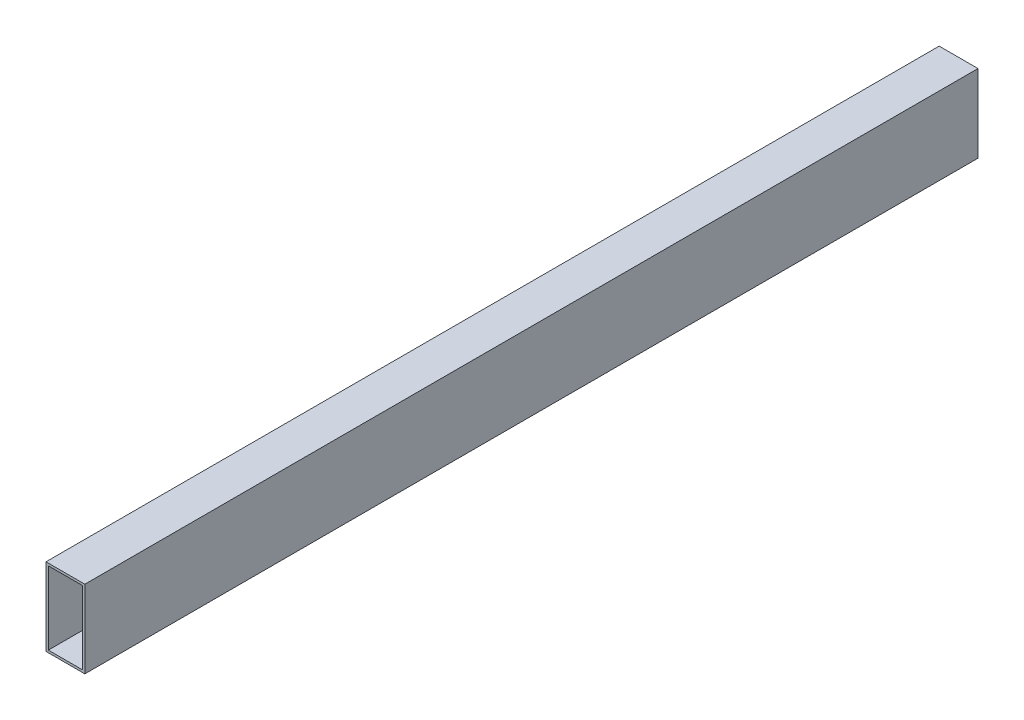
ISO-10303-21;
HEADER;
FILE_DESCRIPTION(('STEP AP214'),'2;1');
FILE_NAME('part.step','',(''),(''),'','','');
FILE_SCHEMA(('AUTOMOTIVE_DESIGN { 1 0 10303 214 1 1 1 1 }'));
ENDSEC;
DATA;
#1=APPLICATION_CONTEXT('core data for automotive mechanical design processes');
#2=APPLICATION_PROTOCOL_DEFINITION('international standard','automotive_design',2000,#1);
#3=PRODUCT_CONTEXT('',#1,'mechanical');
#4=PRODUCT('Part','Part','',(#3));
#5=PRODUCT_RELATED_PRODUCT_CATEGORY('part','',(#4));
#6=PRODUCT_DEFINITION_FORMATION('','',#4);
#7=PRODUCT_DEFINITION_CONTEXT('part definition',#1,'design');
#8=PRODUCT_DEFINITION('design','',#6,#7);
#9=PRODUCT_DEFINITION_SHAPE('','',#8);
#10=(LENGTH_UNIT() NAMED_UNIT(*) SI_UNIT(.MILLI.,.METRE.));
#11=(NAMED_UNIT(*) PLANE_ANGLE_UNIT() SI_UNIT($,.RADIAN.));
#12=(NAMED_UNIT(*) SI_UNIT($,.STERADIAN.) SOLID_ANGLE_UNIT());
#13=UNCERTAINTY_MEASURE_WITH_UNIT(LENGTH_MEASURE(1.E-05),#10,'distance_accuracy_value','');
#14=(GEOMETRIC_REPRESENTATION_CONTEXT(3) GLOBAL_UNCERTAINTY_ASSIGNED_CONTEXT((#13)) GLOBAL_UNIT_ASSIGNED_CONTEXT((#10,
#11,#12)) REPRESENTATION_CONTEXT('',''));
#15=CARTESIAN_POINT('',(0.,0.,0.));
#16=DIRECTION('',(0.,0.,1.));
#17=DIRECTION('',(1.,0.,0.));
#18=AXIS2_PLACEMENT_3D('',#15,#16,#17);
#19=CARTESIAN_POINT('',(0.,0.,584.2));
#20=DIRECTION('',(0.,0.,1.));
#21=DIRECTION('',(1.,0.,0.));
#22=AXIS2_PLACEMENT_3D('',#19,#20,#21);
#23=PLANE('',#22);
#24=DIRECTION('',(0.,-1.,0.));
#25=VECTOR('',#24,1.);
#26=CARTESIAN_POINT('',(-25.4,50.8,584.2));
#27=LINE('',#26,#25);
#28=CARTESIAN_POINT('',(-25.4,50.8,584.2));
#29=VERTEX_POINT('',#28);
#30=CARTESIAN_POINT('',(-25.4,0.,584.2));
#31=VERTEX_POINT('',#30);
#32=EDGE_CURVE('E177',#29,#31,#27,.T.);
#33=ORIENTED_EDGE('',*,*,#32,.T.);
#34=DIRECTION('',(1.,0.,0.));
#35=VECTOR('',#34,1.);
#36=CARTESIAN_POINT('',(-25.4,0.,584.2));
#37=LINE('',#36,#35);
#38=CARTESIAN_POINT('',(0.,0.,584.2));
#39=VERTEX_POINT('',#38);
#40=EDGE_CURVE('E181',#31,#39,#37,.T.);
#41=ORIENTED_EDGE('',*,*,#40,.T.);
#42=DIRECTION('',(0.,1.,0.));
#43=VECTOR('',#42,1.);
#44=CARTESIAN_POINT('',(0.,50.8,584.2));
#45=LINE('',#44,#43);
#46=CARTESIAN_POINT('',(0.,50.8,584.2));
#47=VERTEX_POINT('',#46);
#48=EDGE_CURVE('E185',#39,#47,#45,.T.);
#49=ORIENTED_EDGE('',*,*,#48,.T.);
#50=DIRECTION('',(-1.,0.,0.));
#51=VECTOR('',#50,1.);
#52=CARTESIAN_POINT('',(-25.4,50.8,584.2));
#53=LINE('',#52,#51);
#54=EDGE_CURVE('E188',#47,#29,#53,.T.);
#55=ORIENTED_EDGE('',*,*,#54,.T.);
#56=EDGE_LOOP('',(#33,#41,#49,#55));
#57=FACE_BOUND('',#56,.T.);
#58=DIRECTION('',(1.,0.,0.));
#59=VECTOR('',#58,1.);
#60=CARTESIAN_POINT('',(-25.4,1.524,584.2));
#61=LINE('',#60,#59);
#62=CARTESIAN_POINT('',(-23.876,1.524,584.2));
#63=VERTEX_POINT('',#62);
#64=CARTESIAN_POINT('',(-1.524,1.524,584.2));
#65=VERTEX_POINT('',#64);
#66=EDGE_CURVE('E138',#63,#65,#61,.T.);
#67=ORIENTED_EDGE('',*,*,#66,.F.);
#68=DIRECTION('',(0.,-1.,0.));
#69=VECTOR('',#68,1.);
#70=CARTESIAN_POINT('',(-23.876,50.8,584.2));
#71=LINE('',#70,#69);
#72=CARTESIAN_POINT('',(-23.876,49.276,584.2));
#73=VERTEX_POINT('',#72);
#74=EDGE_CURVE('E129',#73,#63,#71,.T.);
#75=ORIENTED_EDGE('',*,*,#74,.F.);
#76=DIRECTION('',(-1.,0.,0.));
#77=VECTOR('',#76,1.);
#78=CARTESIAN_POINT('',(-25.4,49.276,584.2));
#79=LINE('',#78,#77);
#80=CARTESIAN_POINT('',(-1.524,49.276,584.2));
#81=VERTEX_POINT('',#80);
#82=EDGE_CURVE('E155',#81,#73,#79,.T.);
#83=ORIENTED_EDGE('',*,*,#82,.F.);
#84=DIRECTION('',(0.,1.,0.));
#85=VECTOR('',#84,1.);
#86=CARTESIAN_POINT('',(-1.524,50.8,584.2));
#87=LINE('',#86,#85);
#88=EDGE_CURVE('E151',#65,#81,#87,.T.);
#89=ORIENTED_EDGE('',*,*,#88,.F.);
#90=EDGE_LOOP('',(#67,#75,#83,#89));
#91=FACE_BOUND('',#90,.T.);
#92=ADVANCED_FACE('F63',(#57,#91),#23,.T.);
#93=CARTESIAN_POINT('',(0.,0.,0.));
#94=DIRECTION('',(0.,0.,1.));
#95=DIRECTION('',(1.,0.,0.));
#96=AXIS2_PLACEMENT_3D('',#93,#94,#95);
#97=PLANE('',#96);
#98=DIRECTION('',(0.,-1.,0.));
#99=VECTOR('',#98,1.);
#100=CARTESIAN_POINT('',(-25.4,50.8,0.));
#101=LINE('',#100,#99);
#102=CARTESIAN_POINT('',(-25.4,50.8,0.));
#103=VERTEX_POINT('',#102);
#104=CARTESIAN_POINT('',(-25.4,0.,0.));
#105=VERTEX_POINT('',#104);
#106=EDGE_CURVE('E147',#103,#105,#101,.T.);
#107=ORIENTED_EDGE('',*,*,#106,.F.);
#108=DIRECTION('',(-1.,0.,0.));
#109=VECTOR('',#108,1.);
#110=CARTESIAN_POINT('',(-25.4,50.8,0.));
#111=LINE('',#110,#109);
#112=CARTESIAN_POINT('',(0.,50.8,0.));
#113=VERTEX_POINT('',#112);
#114=EDGE_CURVE('E182',#113,#103,#111,.T.);
#115=ORIENTED_EDGE('',*,*,#114,.F.);
#116=DIRECTION('',(0.,1.,0.));
#117=VECTOR('',#116,1.);
#118=CARTESIAN_POINT('',(0.,50.8,0.));
#119=LINE('',#118,#117);
#120=CARTESIAN_POINT('',(0.,0.,0.));
#121=VERTEX_POINT('',#120);
#122=EDGE_CURVE('E198',#121,#113,#119,.T.);
#123=ORIENTED_EDGE('',*,*,#122,.F.);
#124=DIRECTION('',(1.,0.,0.));
#125=VECTOR('',#124,1.);
#126=CARTESIAN_POINT('',(-25.4,0.,0.));
#127=LINE('',#126,#125);
#128=EDGE_CURVE('E195',#105,#121,#127,.T.);
#129=ORIENTED_EDGE('',*,*,#128,.F.);
#130=EDGE_LOOP('',(#107,#115,#123,#129));
#131=FACE_BOUND('',#130,.T.);
#132=DIRECTION('',(0.,-1.,0.));
#133=VECTOR('',#132,1.);
#134=CARTESIAN_POINT('',(-23.876,50.8,0.));
#135=LINE('',#134,#133);
#136=CARTESIAN_POINT('',(-23.876,49.276,0.));
#137=VERTEX_POINT('',#136);
#138=CARTESIAN_POINT('',(-23.876,1.524,0.));
#139=VERTEX_POINT('',#138);
#140=EDGE_CURVE('E87',#137,#139,#135,.T.);
#141=ORIENTED_EDGE('',*,*,#140,.T.);
#142=DIRECTION('',(1.,0.,0.));
#143=VECTOR('',#142,1.);
#144=CARTESIAN_POINT('',(-25.4,1.524,0.));
#145=LINE('',#144,#143);
#146=CARTESIAN_POINT('',(-1.524,1.524,0.));
#147=VERTEX_POINT('',#146);
#148=EDGE_CURVE('E145',#139,#147,#145,.T.);
#149=ORIENTED_EDGE('',*,*,#148,.T.);
#150=DIRECTION('',(0.,1.,0.));
#151=VECTOR('',#150,1.);
#152=CARTESIAN_POINT('',(-1.524,50.8,0.));
#153=LINE('',#152,#151);
#154=CARTESIAN_POINT('',(-1.524,49.276,0.));
#155=VERTEX_POINT('',#154);
#156=EDGE_CURVE('E164',#147,#155,#153,.T.);
#157=ORIENTED_EDGE('',*,*,#156,.T.);
#158=DIRECTION('',(-1.,0.,0.));
#159=VECTOR('',#158,1.);
#160=CARTESIAN_POINT('',(-25.4,49.276,0.));
#161=LINE('',#160,#159);
#162=EDGE_CURVE('E139',#155,#137,#161,.T.);
#163=ORIENTED_EDGE('',*,*,#162,.T.);
#164=EDGE_LOOP('',(#141,#149,#157,#163));
#165=FACE_BOUND('',#164,.T.);
#166=ADVANCED_FACE('F221',(#131,#165),#97,.F.);
#167=CARTESIAN_POINT('',(-25.4,50.8,584.2));
#168=DIRECTION('',(1.,0.,0.));
#169=DIRECTION('',(0.,1.,0.));
#170=AXIS2_PLACEMENT_3D('',#167,#168,#169);
#171=PLANE('',#170);
#172=ORIENTED_EDGE('',*,*,#106,.T.);
#173=DIRECTION('',(0.,0.,-1.));
#174=VECTOR('',#173,1.);
#175=CARTESIAN_POINT('',(-25.4,0.,584.2));
#176=LINE('',#175,#174);
#177=EDGE_CURVE('E12',#31,#105,#176,.T.);
#178=ORIENTED_EDGE('',*,*,#177,.F.);
#179=ORIENTED_EDGE('',*,*,#32,.F.);
#180=DIRECTION('',(0.,0.,-1.));
#181=VECTOR('',#180,1.);
#182=CARTESIAN_POINT('',(-25.4,50.8,584.2));
#183=LINE('',#182,#181);
#184=EDGE_CURVE('E191',#29,#103,#183,.T.);
#185=ORIENTED_EDGE('',*,*,#184,.T.);
#186=EDGE_LOOP('',(#172,#178,#179,#185));
#187=FACE_BOUND('',#186,.T.);
#188=ADVANCED_FACE('F65',(#187),#171,.F.);
#189=CARTESIAN_POINT('',(-25.4,0.,584.2));
#190=DIRECTION('',(0.,1.,0.));
#191=DIRECTION('',(0.,0.,1.));
#192=AXIS2_PLACEMENT_3D('',#189,#190,#191);
#193=PLANE('',#192);
#194=ORIENTED_EDGE('',*,*,#128,.T.);
#195=DIRECTION('',(0.,0.,-1.));
#196=VECTOR('',#195,1.);
#197=CARTESIAN_POINT('',(0.,0.,584.2));
#198=LINE('',#197,#196);
#199=EDGE_CURVE('E72',#39,#121,#198,.T.);
#200=ORIENTED_EDGE('',*,*,#199,.F.);
#201=ORIENTED_EDGE('',*,*,#40,.F.);
#202=ORIENTED_EDGE('',*,*,#177,.T.);
#203=EDGE_LOOP('',(#194,#200,#201,#202));
#204=FACE_BOUND('',#203,.T.);
#205=ADVANCED_FACE('F231',(#204),#193,.F.);
#206=CARTESIAN_POINT('',(0.,50.8,584.2));
#207=DIRECTION('',(-1.,0.,0.));
#208=DIRECTION('',(0.,0.,1.));
#209=AXIS2_PLACEMENT_3D('',#206,#207,#208);
#210=PLANE('',#209);
#211=ORIENTED_EDGE('',*,*,#122,.T.);
#212=DIRECTION('',(0.,0.,-1.));
#213=VECTOR('',#212,1.);
#214=CARTESIAN_POINT('',(0.,50.8,584.2));
#215=LINE('',#214,#213);
#216=EDGE_CURVE('E206',#47,#113,#215,.T.);
#217=ORIENTED_EDGE('',*,*,#216,.F.);
#218=ORIENTED_EDGE('',*,*,#48,.F.);
#219=ORIENTED_EDGE('',*,*,#199,.T.);
#220=EDGE_LOOP('',(#211,#217,#218,#219));
#221=FACE_BOUND('',#220,.T.);
#222=ADVANCED_FACE('F215',(#221),#210,.F.);
#223=CARTESIAN_POINT('',(-25.4,50.8,584.2));
#224=DIRECTION('',(0.,-1.,0.));
#225=DIRECTION('',(0.,0.,-1.));
#226=AXIS2_PLACEMENT_3D('',#223,#224,#225);
#227=PLANE('',#226);
#228=ORIENTED_EDGE('',*,*,#114,.T.);
#229=ORIENTED_EDGE('',*,*,#184,.F.);
#230=ORIENTED_EDGE('',*,*,#54,.F.);
#231=ORIENTED_EDGE('',*,*,#216,.T.);
#232=EDGE_LOOP('',(#228,#229,#230,#231));
#233=FACE_BOUND('',#232,.T.);
#234=ADVANCED_FACE('F225',(#233),#227,.F.);
#235=CARTESIAN_POINT('',(-23.876,50.8,584.2));
#236=DIRECTION('',(1.,0.,0.));
#237=DIRECTION('',(0.,1.,0.));
#238=AXIS2_PLACEMENT_3D('',#235,#236,#237);
#239=PLANE('',#238);
#240=ORIENTED_EDGE('',*,*,#140,.F.);
#241=DIRECTION('',(0.,0.,-1.));
#242=VECTOR('',#241,1.);
#243=CARTESIAN_POINT('',(-23.876,49.276,584.2));
#244=LINE('',#243,#242);
#245=EDGE_CURVE('E133',#73,#137,#244,.T.);
#246=ORIENTED_EDGE('',*,*,#245,.F.);
#247=ORIENTED_EDGE('',*,*,#74,.T.);
#248=DIRECTION('',(0.,0.,-1.));
#249=VECTOR('',#248,1.);
#250=CARTESIAN_POINT('',(-23.876,1.524,584.2));
#251=LINE('',#250,#249);
#252=EDGE_CURVE('E132',#63,#139,#251,.T.);
#253=ORIENTED_EDGE('',*,*,#252,.T.);
#254=EDGE_LOOP('',(#240,#246,#247,#253));
#255=FACE_BOUND('',#254,.T.);
#256=ADVANCED_FACE('F131',(#255),#239,.T.);
#257=CARTESIAN_POINT('',(-25.4,1.524,584.2));
#258=DIRECTION('',(0.,1.,0.));
#259=DIRECTION('',(0.,0.,1.));
#260=AXIS2_PLACEMENT_3D('',#257,#258,#259);
#261=PLANE('',#260);
#262=ORIENTED_EDGE('',*,*,#148,.F.);
#263=ORIENTED_EDGE('',*,*,#252,.F.);
#264=ORIENTED_EDGE('',*,*,#66,.T.);
#265=DIRECTION('',(0.,0.,-1.));
#266=VECTOR('',#265,1.);
#267=CARTESIAN_POINT('',(-1.524,1.524,584.2));
#268=LINE('',#267,#266);
#269=EDGE_CURVE('E148',#65,#147,#268,.T.);
#270=ORIENTED_EDGE('',*,*,#269,.T.);
#271=EDGE_LOOP('',(#262,#263,#264,#270));
#272=FACE_BOUND('',#271,.T.);
#273=ADVANCED_FACE('F142',(#272),#261,.T.);
#274=CARTESIAN_POINT('',(-1.524,50.8,584.2));
#275=DIRECTION('',(-1.,0.,0.));
#276=DIRECTION('',(0.,0.,1.));
#277=AXIS2_PLACEMENT_3D('',#274,#275,#276);
#278=PLANE('',#277);
#279=ORIENTED_EDGE('',*,*,#156,.F.);
#280=ORIENTED_EDGE('',*,*,#269,.F.);
#281=ORIENTED_EDGE('',*,*,#88,.T.);
#282=DIRECTION('',(0.,0.,-1.));
#283=VECTOR('',#282,1.);
#284=CARTESIAN_POINT('',(-1.524,49.276,584.2));
#285=LINE('',#284,#283);
#286=EDGE_CURVE('E79',#81,#155,#285,.T.);
#287=ORIENTED_EDGE('',*,*,#286,.T.);
#288=EDGE_LOOP('',(#279,#280,#281,#287));
#289=FACE_BOUND('',#288,.T.);
#290=ADVANCED_FACE('F254',(#289),#278,.T.);
#291=CARTESIAN_POINT('',(-25.4,49.276,584.2));
#292=DIRECTION('',(0.,-1.,0.));
#293=DIRECTION('',(0.,0.,-1.));
#294=AXIS2_PLACEMENT_3D('',#291,#292,#293);
#295=PLANE('',#294);
#296=ORIENTED_EDGE('',*,*,#162,.F.);
#297=ORIENTED_EDGE('',*,*,#286,.F.);
#298=ORIENTED_EDGE('',*,*,#82,.T.);
#299=ORIENTED_EDGE('',*,*,#245,.T.);
#300=EDGE_LOOP('',(#296,#297,#298,#299));
#301=FACE_BOUND('',#300,.T.);
#302=ADVANCED_FACE('F258',(#301),#295,.T.);
#303=CLOSED_SHELL('',(#92,#166,#188,#205,#222,#234,#256,#273,#290,#302));
#304=MANIFOLD_SOLID_BREP('B2',#303);
#305=ADVANCED_BREP_SHAPE_REPRESENTATION('',(#18,#304),#14);
#306=SHAPE_DEFINITION_REPRESENTATION(#9,#305);
ENDSEC;
END-ISO-10303-21;
